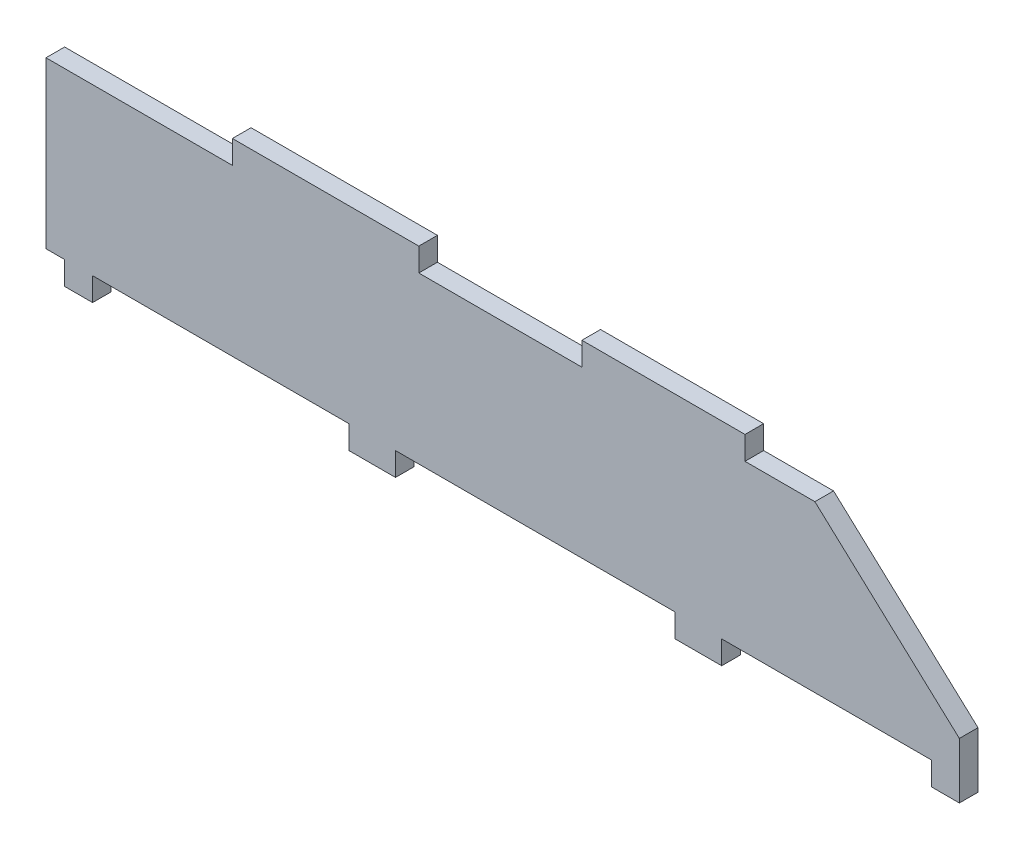
ISO-10303-21;
HEADER;
FILE_DESCRIPTION(('STEP AP214'),'2;1');
FILE_NAME('part.step','',(''),(''),'','','');
FILE_SCHEMA(('AUTOMOTIVE_DESIGN { 1 0 10303 214 1 1 1 1 }'));
ENDSEC;
DATA;
#1=APPLICATION_CONTEXT('core data for automotive mechanical design processes');
#2=APPLICATION_PROTOCOL_DEFINITION('international standard','automotive_design',2000,#1);
#3=PRODUCT_CONTEXT('',#1,'mechanical');
#4=PRODUCT('Part','Part','',(#3));
#5=PRODUCT_RELATED_PRODUCT_CATEGORY('part','',(#4));
#6=PRODUCT_DEFINITION_FORMATION('','',#4);
#7=PRODUCT_DEFINITION_CONTEXT('part definition',#1,'design');
#8=PRODUCT_DEFINITION('design','',#6,#7);
#9=PRODUCT_DEFINITION_SHAPE('','',#8);
#10=(LENGTH_UNIT() NAMED_UNIT(*) SI_UNIT(.MILLI.,.METRE.));
#11=(NAMED_UNIT(*) PLANE_ANGLE_UNIT() SI_UNIT($,.RADIAN.));
#12=(NAMED_UNIT(*) SI_UNIT($,.STERADIAN.) SOLID_ANGLE_UNIT());
#13=UNCERTAINTY_MEASURE_WITH_UNIT(LENGTH_MEASURE(1.E-05),#10,'distance_accuracy_value','');
#14=(GEOMETRIC_REPRESENTATION_CONTEXT(3) GLOBAL_UNCERTAINTY_ASSIGNED_CONTEXT((#13)) GLOBAL_UNIT_ASSIGNED_CONTEXT((#10,
#11,#12)) REPRESENTATION_CONTEXT('',''));
#15=CARTESIAN_POINT('',(0.,0.,0.));
#16=DIRECTION('',(0.,0.,1.));
#17=DIRECTION('',(1.,0.,0.));
#18=AXIS2_PLACEMENT_3D('',#15,#16,#17);
#19=CARTESIAN_POINT('',(35.,0.,4.));
#20=DIRECTION('',(1.,0.,0.));
#21=DIRECTION('',(0.,0.,-1.));
#22=AXIS2_PLACEMENT_3D('',#19,#20,#21);
#23=PLANE('',#22);
#24=DIRECTION('',(0.,-1.,0.));
#25=VECTOR('',#24,1.);
#26=CARTESIAN_POINT('',(35.,0.,0.));
#27=LINE('',#26,#25);
#28=CARTESIAN_POINT('',(35.,0.,0.));
#29=VERTEX_POINT('',#28);
#30=CARTESIAN_POINT('',(35.,-5.,0.));
#31=VERTEX_POINT('',#30);
#32=EDGE_CURVE('E243',#29,#31,#27,.T.);
#33=ORIENTED_EDGE('',*,*,#32,.T.);
#34=DIRECTION('',(0.,0.,-1.));
#35=VECTOR('',#34,1.);
#36=CARTESIAN_POINT('',(35.,-5.,4.));
#37=LINE('',#36,#35);
#38=CARTESIAN_POINT('',(35.,-5.,4.));
#39=VERTEX_POINT('',#38);
#40=EDGE_CURVE('E40',#39,#31,#37,.T.);
#41=ORIENTED_EDGE('',*,*,#40,.F.);
#42=DIRECTION('',(0.,-1.,0.));
#43=VECTOR('',#42,1.);
#44=CARTESIAN_POINT('',(35.,0.,4.));
#45=LINE('',#44,#43);
#46=CARTESIAN_POINT('',(35.,0.,4.));
#47=VERTEX_POINT('',#46);
#48=EDGE_CURVE('E147',#47,#39,#45,.T.);
#49=ORIENTED_EDGE('',*,*,#48,.F.);
#50=DIRECTION('',(0.,0.,-1.));
#51=VECTOR('',#50,1.);
#52=CARTESIAN_POINT('',(35.,0.,4.));
#53=LINE('',#52,#51);
#54=EDGE_CURVE('E11',#47,#29,#53,.T.);
#55=ORIENTED_EDGE('',*,*,#54,.T.);
#56=EDGE_LOOP('',(#33,#41,#49,#55));
#57=FACE_BOUND('',#56,.T.);
#58=ADVANCED_FACE('F32',(#57),#23,.F.);
#59=CARTESIAN_POINT('',(35.,-5.,4.));
#60=DIRECTION('',(0.,1.,0.));
#61=DIRECTION('',(0.,0.,1.));
#62=AXIS2_PLACEMENT_3D('',#59,#60,#61);
#63=PLANE('',#62);
#64=DIRECTION('',(1.,0.,0.));
#65=VECTOR('',#64,1.);
#66=CARTESIAN_POINT('',(35.,-5.,0.));
#67=LINE('',#66,#65);
#68=CARTESIAN_POINT('',(45.,-5.,0.));
#69=VERTEX_POINT('',#68);
#70=EDGE_CURVE('E245',#31,#69,#67,.T.);
#71=ORIENTED_EDGE('',*,*,#70,.T.);
#72=DIRECTION('',(0.,0.,-1.));
#73=VECTOR('',#72,1.);
#74=CARTESIAN_POINT('',(45.,-5.,4.));
#75=LINE('',#74,#73);
#76=CARTESIAN_POINT('',(45.,-5.,4.));
#77=VERTEX_POINT('',#76);
#78=EDGE_CURVE('E360',#77,#69,#75,.T.);
#79=ORIENTED_EDGE('',*,*,#78,.F.);
#80=DIRECTION('',(1.,0.,0.));
#81=VECTOR('',#80,1.);
#82=CARTESIAN_POINT('',(35.,-5.,4.));
#83=LINE('',#82,#81);
#84=EDGE_CURVE('E368',#39,#77,#83,.T.);
#85=ORIENTED_EDGE('',*,*,#84,.F.);
#86=ORIENTED_EDGE('',*,*,#40,.T.);
#87=EDGE_LOOP('',(#71,#79,#85,#86));
#88=FACE_BOUND('',#87,.T.);
#89=ADVANCED_FACE('F366',(#88),#63,.F.);
#90=CARTESIAN_POINT('',(45.,-5.,4.));
#91=DIRECTION('',(-1.,0.,0.));
#92=DIRECTION('',(0.,0.,1.));
#93=AXIS2_PLACEMENT_3D('',#90,#91,#92);
#94=PLANE('',#93);
#95=DIRECTION('',(0.,1.,0.));
#96=VECTOR('',#95,1.);
#97=CARTESIAN_POINT('',(45.,-5.,0.));
#98=LINE('',#97,#96);
#99=CARTESIAN_POINT('',(45.,0.,0.));
#100=VERTEX_POINT('',#99);
#101=EDGE_CURVE('E247',#69,#100,#98,.T.);
#102=ORIENTED_EDGE('',*,*,#101,.T.);
#103=DIRECTION('',(0.,0.,-1.));
#104=VECTOR('',#103,1.);
#105=CARTESIAN_POINT('',(45.,0.,4.));
#106=LINE('',#105,#104);
#107=CARTESIAN_POINT('',(45.,0.,4.));
#108=VERTEX_POINT('',#107);
#109=EDGE_CURVE('E357',#108,#100,#106,.T.);
#110=ORIENTED_EDGE('',*,*,#109,.F.);
#111=DIRECTION('',(0.,1.,0.));
#112=VECTOR('',#111,1.);
#113=CARTESIAN_POINT('',(45.,-5.,4.));
#114=LINE('',#113,#112);
#115=EDGE_CURVE('E386',#77,#108,#114,.T.);
#116=ORIENTED_EDGE('',*,*,#115,.F.);
#117=ORIENTED_EDGE('',*,*,#78,.T.);
#118=EDGE_LOOP('',(#102,#110,#116,#117));
#119=FACE_BOUND('',#118,.T.);
#120=ADVANCED_FACE('F377',(#119),#94,.F.);
#121=CARTESIAN_POINT('',(45.,0.,4.));
#122=DIRECTION('',(0.,1.,0.));
#123=DIRECTION('',(0.,0.,1.));
#124=AXIS2_PLACEMENT_3D('',#121,#122,#123);
#125=PLANE('',#124);
#126=DIRECTION('',(1.,0.,0.));
#127=VECTOR('',#126,1.);
#128=CARTESIAN_POINT('',(45.,0.,0.));
#129=LINE('',#128,#127);
#130=CARTESIAN_POINT('',(90.,0.,0.));
#131=VERTEX_POINT('',#130);
#132=EDGE_CURVE('E249',#100,#131,#129,.T.);
#133=ORIENTED_EDGE('',*,*,#132,.T.);
#134=DIRECTION('',(0.,0.,-1.));
#135=VECTOR('',#134,1.);
#136=CARTESIAN_POINT('',(90.,0.,4.));
#137=LINE('',#136,#135);
#138=CARTESIAN_POINT('',(90.,0.,4.));
#139=VERTEX_POINT('',#138);
#140=EDGE_CURVE('E354',#139,#131,#137,.T.);
#141=ORIENTED_EDGE('',*,*,#140,.F.);
#142=DIRECTION('',(1.,0.,0.));
#143=VECTOR('',#142,1.);
#144=CARTESIAN_POINT('',(45.,0.,4.));
#145=LINE('',#144,#143);
#146=EDGE_CURVE('E383',#108,#139,#145,.T.);
#147=ORIENTED_EDGE('',*,*,#146,.F.);
#148=ORIENTED_EDGE('',*,*,#109,.T.);
#149=EDGE_LOOP('',(#133,#141,#147,#148));
#150=FACE_BOUND('',#149,.T.);
#151=ADVANCED_FACE('F381',(#150),#125,.F.);
#152=CARTESIAN_POINT('',(90.,0.,4.));
#153=DIRECTION('',(1.,0.,0.));
#154=DIRECTION('',(0.,0.,-1.));
#155=AXIS2_PLACEMENT_3D('',#152,#153,#154);
#156=PLANE('',#155);
#157=DIRECTION('',(0.,-1.,0.));
#158=VECTOR('',#157,1.);
#159=CARTESIAN_POINT('',(90.,0.,0.));
#160=LINE('',#159,#158);
#161=CARTESIAN_POINT('',(90.,-5.,0.));
#162=VERTEX_POINT('',#161);
#163=EDGE_CURVE('E251',#131,#162,#160,.T.);
#164=ORIENTED_EDGE('',*,*,#163,.T.);
#165=DIRECTION('',(0.,0.,-1.));
#166=VECTOR('',#165,1.);
#167=CARTESIAN_POINT('',(90.,-5.,4.));
#168=LINE('',#167,#166);
#169=CARTESIAN_POINT('',(90.,-5.,4.));
#170=VERTEX_POINT('',#169);
#171=EDGE_CURVE('E351',#170,#162,#168,.T.);
#172=ORIENTED_EDGE('',*,*,#171,.F.);
#173=DIRECTION('',(0.,-1.,0.));
#174=VECTOR('',#173,1.);
#175=CARTESIAN_POINT('',(90.,0.,4.));
#176=LINE('',#175,#174);
#177=EDGE_CURVE('E385',#139,#170,#176,.T.);
#178=ORIENTED_EDGE('',*,*,#177,.F.);
#179=ORIENTED_EDGE('',*,*,#140,.T.);
#180=EDGE_LOOP('',(#164,#172,#178,#179));
#181=FACE_BOUND('',#180,.T.);
#182=ADVANCED_FACE('F461',(#181),#156,.F.);
#183=CARTESIAN_POINT('',(90.,-5.,4.));
#184=DIRECTION('',(0.,1.,0.));
#185=DIRECTION('',(0.,0.,1.));
#186=AXIS2_PLACEMENT_3D('',#183,#184,#185);
#187=PLANE('',#186);
#188=DIRECTION('',(1.,0.,0.));
#189=VECTOR('',#188,1.);
#190=CARTESIAN_POINT('',(90.,-5.,0.));
#191=LINE('',#190,#189);
#192=CARTESIAN_POINT('',(96.,-5.,0.));
#193=VERTEX_POINT('',#192);
#194=EDGE_CURVE('E253',#162,#193,#191,.T.);
#195=ORIENTED_EDGE('',*,*,#194,.T.);
#196=DIRECTION('',(0.,0.,-1.));
#197=VECTOR('',#196,1.);
#198=CARTESIAN_POINT('',(96.,-5.,4.));
#199=LINE('',#198,#197);
#200=CARTESIAN_POINT('',(96.,-5.,4.));
#201=VERTEX_POINT('',#200);
#202=EDGE_CURVE('E348',#201,#193,#199,.T.);
#203=ORIENTED_EDGE('',*,*,#202,.F.);
#204=DIRECTION('',(1.,0.,0.));
#205=VECTOR('',#204,1.);
#206=CARTESIAN_POINT('',(90.,-5.,4.));
#207=LINE('',#206,#205);
#208=EDGE_CURVE('E388',#170,#201,#207,.T.);
#209=ORIENTED_EDGE('',*,*,#208,.F.);
#210=ORIENTED_EDGE('',*,*,#171,.T.);
#211=EDGE_LOOP('',(#195,#203,#209,#210));
#212=FACE_BOUND('',#211,.T.);
#213=ADVANCED_FACE('F464',(#212),#187,.F.);
#214=CARTESIAN_POINT('',(96.,0.,4.));
#215=DIRECTION('',(-1.,0.,0.));
#216=DIRECTION('',(0.,0.,1.));
#217=AXIS2_PLACEMENT_3D('',#214,#215,#216);
#218=PLANE('',#217);
#219=DIRECTION('',(0.,1.,0.));
#220=VECTOR('',#219,1.);
#221=CARTESIAN_POINT('',(96.,0.,0.));
#222=LINE('',#221,#220);
#223=CARTESIAN_POINT('',(96.,7.,0.));
#224=VERTEX_POINT('',#223);
#225=EDGE_CURVE('E256',#193,#224,#222,.T.);
#226=ORIENTED_EDGE('',*,*,#225,.T.);
#227=DIRECTION('',(0.,0.,-1.));
#228=VECTOR('',#227,1.);
#229=CARTESIAN_POINT('',(96.,7.,4.));
#230=LINE('',#229,#228);
#231=CARTESIAN_POINT('',(96.,7.,4.));
#232=VERTEX_POINT('',#231);
#233=EDGE_CURVE('E345',#232,#224,#230,.T.);
#234=ORIENTED_EDGE('',*,*,#233,.F.);
#235=DIRECTION('',(0.,1.,0.));
#236=VECTOR('',#235,1.);
#237=CARTESIAN_POINT('',(96.,-5.,4.));
#238=LINE('',#237,#236);
#239=EDGE_CURVE('E394',#201,#232,#238,.T.);
#240=ORIENTED_EDGE('',*,*,#239,.F.);
#241=ORIENTED_EDGE('',*,*,#202,.T.);
#242=EDGE_LOOP('',(#226,#234,#240,#241));
#243=FACE_BOUND('',#242,.T.);
#244=ADVANCED_FACE('F468',(#243),#218,.F.);
#245=CARTESIAN_POINT('',(96.,7.,4.));
#246=DIRECTION('',(-0.676799260883116,-0.736167617100934,0.));
#247=DIRECTION('',(0.736167617100934,-0.676799260883116,0.));
#248=AXIS2_PLACEMENT_3D('',#245,#246,#247);
#249=PLANE('',#248);
#250=DIRECTION('',(-0.736167617100934,0.676799260883116,0.));
#251=VECTOR('',#250,1.);
#252=CARTESIAN_POINT('',(96.,7.,0.));
#253=LINE('',#252,#251);
#254=CARTESIAN_POINT('',(65.,35.5,0.));
#255=VERTEX_POINT('',#254);
#256=EDGE_CURVE('E258',#224,#255,#253,.T.);
#257=ORIENTED_EDGE('',*,*,#256,.T.);
#258=DIRECTION('',(0.,0.,-1.));
#259=VECTOR('',#258,1.);
#260=CARTESIAN_POINT('',(65.,35.5,4.));
#261=LINE('',#260,#259);
#262=CARTESIAN_POINT('',(65.,35.5,4.));
#263=VERTEX_POINT('',#262);
#264=EDGE_CURVE('E343',#263,#255,#261,.T.);
#265=ORIENTED_EDGE('',*,*,#264,.F.);
#266=DIRECTION('',(-0.736167617100934,0.676799260883116,0.));
#267=VECTOR('',#266,1.);
#268=CARTESIAN_POINT('',(96.,7.,4.));
#269=LINE('',#268,#267);
#270=EDGE_CURVE('E396',#232,#263,#269,.T.);
#271=ORIENTED_EDGE('',*,*,#270,.F.);
#272=ORIENTED_EDGE('',*,*,#233,.T.);
#273=EDGE_LOOP('',(#257,#265,#271,#272));
#274=FACE_BOUND('',#273,.T.);
#275=ADVANCED_FACE('F472',(#274),#249,.F.);
#276=CARTESIAN_POINT('',(50.,35.5,4.));
#277=DIRECTION('',(0.,1.,0.));
#278=DIRECTION('',(0.,0.,1.));
#279=AXIS2_PLACEMENT_3D('',#276,#277,#278);
#280=PLANE('',#279);
#281=DIRECTION('',(1.,0.,0.));
#282=VECTOR('',#281,1.);
#283=CARTESIAN_POINT('',(50.,35.5,0.));
#284=LINE('',#283,#282);
#285=CARTESIAN_POINT('',(50.,35.5,0.));
#286=VERTEX_POINT('',#285);
#287=EDGE_CURVE('E261',#286,#255,#284,.T.);
#288=ORIENTED_EDGE('',*,*,#287,.F.);
#289=DIRECTION('',(0.,0.,-1.));
#290=VECTOR('',#289,1.);
#291=CARTESIAN_POINT('',(50.,35.5,4.));
#292=LINE('',#291,#290);
#293=CARTESIAN_POINT('',(50.,35.5,4.));
#294=VERTEX_POINT('',#293);
#295=EDGE_CURVE('E341',#294,#286,#292,.T.);
#296=ORIENTED_EDGE('',*,*,#295,.F.);
#297=DIRECTION('',(1.,0.,0.));
#298=VECTOR('',#297,1.);
#299=CARTESIAN_POINT('',(50.,35.5,4.));
#300=LINE('',#299,#298);
#301=EDGE_CURVE('E398',#294,#263,#300,.T.);
#302=ORIENTED_EDGE('',*,*,#301,.T.);
#303=ORIENTED_EDGE('',*,*,#264,.T.);
#304=EDGE_LOOP('',(#288,#296,#302,#303));
#305=FACE_BOUND('',#304,.T.);
#306=ADVANCED_FACE('F476',(#305),#280,.T.);
#307=CARTESIAN_POINT('',(50.,40.5,4.));
#308=DIRECTION('',(1.,0.,0.));
#309=DIRECTION('',(0.,0.,-1.));
#310=AXIS2_PLACEMENT_3D('',#307,#308,#309);
#311=PLANE('',#310);
#312=DIRECTION('',(0.,-1.,0.));
#313=VECTOR('',#312,1.);
#314=CARTESIAN_POINT('',(50.,40.5,0.));
#315=LINE('',#314,#313);
#316=CARTESIAN_POINT('',(50.,40.5,0.));
#317=VERTEX_POINT('',#316);
#318=EDGE_CURVE('E264',#317,#286,#315,.T.);
#319=ORIENTED_EDGE('',*,*,#318,.F.);
#320=DIRECTION('',(0.,0.,-1.));
#321=VECTOR('',#320,1.);
#322=CARTESIAN_POINT('',(50.,40.5,4.));
#323=LINE('',#322,#321);
#324=CARTESIAN_POINT('',(50.,40.5,4.));
#325=VERTEX_POINT('',#324);
#326=EDGE_CURVE('E339',#325,#317,#323,.T.);
#327=ORIENTED_EDGE('',*,*,#326,.F.);
#328=DIRECTION('',(0.,-1.,0.));
#329=VECTOR('',#328,1.);
#330=CARTESIAN_POINT('',(50.,40.5,4.));
#331=LINE('',#330,#329);
#332=EDGE_CURVE('E401',#325,#294,#331,.T.);
#333=ORIENTED_EDGE('',*,*,#332,.T.);
#334=ORIENTED_EDGE('',*,*,#295,.T.);
#335=EDGE_LOOP('',(#319,#327,#333,#334));
#336=FACE_BOUND('',#335,.T.);
#337=ADVANCED_FACE('F480',(#336),#311,.T.);
#338=CARTESIAN_POINT('',(15.,40.5,4.));
#339=DIRECTION('',(0.,1.,0.));
#340=DIRECTION('',(0.,0.,1.));
#341=AXIS2_PLACEMENT_3D('',#338,#339,#340);
#342=PLANE('',#341);
#343=DIRECTION('',(1.,0.,0.));
#344=VECTOR('',#343,1.);
#345=CARTESIAN_POINT('',(15.,40.5,0.));
#346=LINE('',#345,#344);
#347=CARTESIAN_POINT('',(15.,40.5,0.));
#348=VERTEX_POINT('',#347);
#349=EDGE_CURVE('E267',#348,#317,#346,.T.);
#350=ORIENTED_EDGE('',*,*,#349,.F.);
#351=DIRECTION('',(0.,0.,-1.));
#352=VECTOR('',#351,1.);
#353=CARTESIAN_POINT('',(15.,40.5,4.));
#354=LINE('',#353,#352);
#355=CARTESIAN_POINT('',(15.,40.5,4.));
#356=VERTEX_POINT('',#355);
#357=EDGE_CURVE('E337',#356,#348,#354,.T.);
#358=ORIENTED_EDGE('',*,*,#357,.F.);
#359=DIRECTION('',(1.,0.,0.));
#360=VECTOR('',#359,1.);
#361=CARTESIAN_POINT('',(15.,40.5,4.));
#362=LINE('',#361,#360);
#363=EDGE_CURVE('E404',#356,#325,#362,.T.);
#364=ORIENTED_EDGE('',*,*,#363,.T.);
#365=ORIENTED_EDGE('',*,*,#326,.T.);
#366=EDGE_LOOP('',(#350,#358,#364,#365));
#367=FACE_BOUND('',#366,.T.);
#368=ADVANCED_FACE('F484',(#367),#342,.T.);
#369=CARTESIAN_POINT('',(15.,35.5,4.));
#370=DIRECTION('',(-1.,0.,0.));
#371=DIRECTION('',(0.,0.,1.));
#372=AXIS2_PLACEMENT_3D('',#369,#370,#371);
#373=PLANE('',#372);
#374=DIRECTION('',(0.,1.,0.));
#375=VECTOR('',#374,1.);
#376=CARTESIAN_POINT('',(15.,35.5,0.));
#377=LINE('',#376,#375);
#378=CARTESIAN_POINT('',(15.,35.5,0.));
#379=VERTEX_POINT('',#378);
#380=EDGE_CURVE('E270',#379,#348,#377,.T.);
#381=ORIENTED_EDGE('',*,*,#380,.F.);
#382=DIRECTION('',(0.,0.,-1.));
#383=VECTOR('',#382,1.);
#384=CARTESIAN_POINT('',(15.,35.5,4.));
#385=LINE('',#384,#383);
#386=CARTESIAN_POINT('',(15.,35.5,4.));
#387=VERTEX_POINT('',#386);
#388=EDGE_CURVE('E335',#387,#379,#385,.T.);
#389=ORIENTED_EDGE('',*,*,#388,.F.);
#390=DIRECTION('',(0.,1.,0.));
#391=VECTOR('',#390,1.);
#392=CARTESIAN_POINT('',(15.,35.5,4.));
#393=LINE('',#392,#391);
#394=EDGE_CURVE('E407',#387,#356,#393,.T.);
#395=ORIENTED_EDGE('',*,*,#394,.T.);
#396=ORIENTED_EDGE('',*,*,#357,.T.);
#397=EDGE_LOOP('',(#381,#389,#395,#396));
#398=FACE_BOUND('',#397,.T.);
#399=ADVANCED_FACE('F488',(#398),#373,.T.);
#400=CARTESIAN_POINT('',(-20.,35.5,4.));
#401=DIRECTION('',(0.,1.,0.));
#402=DIRECTION('',(0.,0.,1.));
#403=AXIS2_PLACEMENT_3D('',#400,#401,#402);
#404=PLANE('',#403);
#405=DIRECTION('',(1.,0.,0.));
#406=VECTOR('',#405,1.);
#407=CARTESIAN_POINT('',(-20.,35.5,0.));
#408=LINE('',#407,#406);
#409=CARTESIAN_POINT('',(-20.,35.5,0.));
#410=VERTEX_POINT('',#409);
#411=EDGE_CURVE('E273',#410,#379,#408,.T.);
#412=ORIENTED_EDGE('',*,*,#411,.F.);
#413=DIRECTION('',(0.,0.,-1.));
#414=VECTOR('',#413,1.);
#415=CARTESIAN_POINT('',(-20.,35.5,4.));
#416=LINE('',#415,#414);
#417=CARTESIAN_POINT('',(-20.,35.5,4.));
#418=VERTEX_POINT('',#417);
#419=EDGE_CURVE('E333',#418,#410,#416,.T.);
#420=ORIENTED_EDGE('',*,*,#419,.F.);
#421=DIRECTION('',(1.,0.,0.));
#422=VECTOR('',#421,1.);
#423=CARTESIAN_POINT('',(-20.,35.5,4.));
#424=LINE('',#423,#422);
#425=EDGE_CURVE('E410',#418,#387,#424,.T.);
#426=ORIENTED_EDGE('',*,*,#425,.T.);
#427=ORIENTED_EDGE('',*,*,#388,.T.);
#428=EDGE_LOOP('',(#412,#420,#426,#427));
#429=FACE_BOUND('',#428,.T.);
#430=ADVANCED_FACE('F492',(#429),#404,.T.);
#431=CARTESIAN_POINT('',(-20.,40.5,4.));
#432=DIRECTION('',(1.,0.,0.));
#433=DIRECTION('',(0.,0.,-1.));
#434=AXIS2_PLACEMENT_3D('',#431,#432,#433);
#435=PLANE('',#434);
#436=DIRECTION('',(0.,-1.,0.));
#437=VECTOR('',#436,1.);
#438=CARTESIAN_POINT('',(-20.,40.5,0.));
#439=LINE('',#438,#437);
#440=CARTESIAN_POINT('',(-20.,40.5,0.));
#441=VERTEX_POINT('',#440);
#442=EDGE_CURVE('E276',#441,#410,#439,.T.);
#443=ORIENTED_EDGE('',*,*,#442,.F.);
#444=DIRECTION('',(0.,0.,-1.));
#445=VECTOR('',#444,1.);
#446=CARTESIAN_POINT('',(-20.,40.5,4.));
#447=LINE('',#446,#445);
#448=CARTESIAN_POINT('',(-20.,40.5,4.));
#449=VERTEX_POINT('',#448);
#450=EDGE_CURVE('E331',#449,#441,#447,.T.);
#451=ORIENTED_EDGE('',*,*,#450,.F.);
#452=DIRECTION('',(0.,-1.,0.));
#453=VECTOR('',#452,1.);
#454=CARTESIAN_POINT('',(-20.,40.5,4.));
#455=LINE('',#454,#453);
#456=EDGE_CURVE('E413',#449,#418,#455,.T.);
#457=ORIENTED_EDGE('',*,*,#456,.T.);
#458=ORIENTED_EDGE('',*,*,#419,.T.);
#459=EDGE_LOOP('',(#443,#451,#457,#458));
#460=FACE_BOUND('',#459,.T.);
#461=ADVANCED_FACE('F496',(#460),#435,.T.);
#462=CARTESIAN_POINT('',(-60.,40.5,4.));
#463=DIRECTION('',(0.,1.,0.));
#464=DIRECTION('',(0.,0.,1.));
#465=AXIS2_PLACEMENT_3D('',#462,#463,#464);
#466=PLANE('',#465);
#467=DIRECTION('',(1.,0.,0.));
#468=VECTOR('',#467,1.);
#469=CARTESIAN_POINT('',(-60.,40.5,0.));
#470=LINE('',#469,#468);
#471=CARTESIAN_POINT('',(-60.,40.5,0.));
#472=VERTEX_POINT('',#471);
#473=EDGE_CURVE('E279',#472,#441,#470,.T.);
#474=ORIENTED_EDGE('',*,*,#473,.F.);
#475=DIRECTION('',(0.,0.,-1.));
#476=VECTOR('',#475,1.);
#477=CARTESIAN_POINT('',(-60.,40.5,4.));
#478=LINE('',#477,#476);
#479=CARTESIAN_POINT('',(-60.,40.5,4.));
#480=VERTEX_POINT('',#479);
#481=EDGE_CURVE('E329',#480,#472,#478,.T.);
#482=ORIENTED_EDGE('',*,*,#481,.F.);
#483=DIRECTION('',(1.,0.,0.));
#484=VECTOR('',#483,1.);
#485=CARTESIAN_POINT('',(-60.,40.5,4.));
#486=LINE('',#485,#484);
#487=EDGE_CURVE('E416',#480,#449,#486,.T.);
#488=ORIENTED_EDGE('',*,*,#487,.T.);
#489=ORIENTED_EDGE('',*,*,#450,.T.);
#490=EDGE_LOOP('',(#474,#482,#488,#489));
#491=FACE_BOUND('',#490,.T.);
#492=ADVANCED_FACE('F500',(#491),#466,.T.);
#493=CARTESIAN_POINT('',(-60.,35.5,4.));
#494=DIRECTION('',(-1.,0.,0.));
#495=DIRECTION('',(0.,0.,1.));
#496=AXIS2_PLACEMENT_3D('',#493,#494,#495);
#497=PLANE('',#496);
#498=DIRECTION('',(0.,1.,0.));
#499=VECTOR('',#498,1.);
#500=CARTESIAN_POINT('',(-60.,35.5,0.));
#501=LINE('',#500,#499);
#502=CARTESIAN_POINT('',(-60.,35.5,0.));
#503=VERTEX_POINT('',#502);
#504=EDGE_CURVE('E282',#503,#472,#501,.T.);
#505=ORIENTED_EDGE('',*,*,#504,.F.);
#506=DIRECTION('',(0.,0.,-1.));
#507=VECTOR('',#506,1.);
#508=CARTESIAN_POINT('',(-60.,35.5,4.));
#509=LINE('',#508,#507);
#510=CARTESIAN_POINT('',(-60.,35.5,4.));
#511=VERTEX_POINT('',#510);
#512=EDGE_CURVE('E327',#511,#503,#509,.T.);
#513=ORIENTED_EDGE('',*,*,#512,.F.);
#514=DIRECTION('',(0.,1.,0.));
#515=VECTOR('',#514,1.);
#516=CARTESIAN_POINT('',(-60.,35.5,4.));
#517=LINE('',#516,#515);
#518=EDGE_CURVE('E419',#511,#480,#517,.T.);
#519=ORIENTED_EDGE('',*,*,#518,.T.);
#520=ORIENTED_EDGE('',*,*,#481,.T.);
#521=EDGE_LOOP('',(#505,#513,#519,#520));
#522=FACE_BOUND('',#521,.T.);
#523=ADVANCED_FACE('F504',(#522),#497,.T.);
#524=CARTESIAN_POINT('',(-100.,35.5,4.));
#525=DIRECTION('',(0.,1.,0.));
#526=DIRECTION('',(0.,0.,1.));
#527=AXIS2_PLACEMENT_3D('',#524,#525,#526);
#528=PLANE('',#527);
#529=DIRECTION('',(1.,0.,0.));
#530=VECTOR('',#529,1.);
#531=CARTESIAN_POINT('',(-100.,35.5,0.));
#532=LINE('',#531,#530);
#533=CARTESIAN_POINT('',(-100.,35.5,0.));
#534=VERTEX_POINT('',#533);
#535=EDGE_CURVE('E285',#534,#503,#532,.T.);
#536=ORIENTED_EDGE('',*,*,#535,.F.);
#537=DIRECTION('',(0.,0.,-1.));
#538=VECTOR('',#537,1.);
#539=CARTESIAN_POINT('',(-100.,35.5,4.));
#540=LINE('',#539,#538);
#541=CARTESIAN_POINT('',(-100.,35.5,4.));
#542=VERTEX_POINT('',#541);
#543=EDGE_CURVE('E325',#542,#534,#540,.T.);
#544=ORIENTED_EDGE('',*,*,#543,.F.);
#545=DIRECTION('',(1.,0.,0.));
#546=VECTOR('',#545,1.);
#547=CARTESIAN_POINT('',(-100.,35.5,4.));
#548=LINE('',#547,#546);
#549=EDGE_CURVE('E422',#542,#511,#548,.T.);
#550=ORIENTED_EDGE('',*,*,#549,.T.);
#551=ORIENTED_EDGE('',*,*,#512,.T.);
#552=EDGE_LOOP('',(#536,#544,#550,#551));
#553=FACE_BOUND('',#552,.T.);
#554=ADVANCED_FACE('F508',(#553),#528,.T.);
#555=CARTESIAN_POINT('',(-100.,0.,4.));
#556=DIRECTION('',(-1.,0.,0.));
#557=DIRECTION('',(0.,0.,1.));
#558=AXIS2_PLACEMENT_3D('',#555,#556,#557);
#559=PLANE('',#558);
#560=DIRECTION('',(0.,1.,0.));
#561=VECTOR('',#560,1.);
#562=CARTESIAN_POINT('',(-100.,0.,0.));
#563=LINE('',#562,#561);
#564=CARTESIAN_POINT('',(-100.,0.,0.));
#565=VERTEX_POINT('',#564);
#566=EDGE_CURVE('E288',#565,#534,#563,.T.);
#567=ORIENTED_EDGE('',*,*,#566,.F.);
#568=DIRECTION('',(0.,0.,-1.));
#569=VECTOR('',#568,1.);
#570=CARTESIAN_POINT('',(-100.,0.,4.));
#571=LINE('',#570,#569);
#572=CARTESIAN_POINT('',(-100.,0.,4.));
#573=VERTEX_POINT('',#572);
#574=EDGE_CURVE('E323',#573,#565,#571,.T.);
#575=ORIENTED_EDGE('',*,*,#574,.F.);
#576=DIRECTION('',(0.,1.,0.));
#577=VECTOR('',#576,1.);
#578=CARTESIAN_POINT('',(-100.,0.,4.));
#579=LINE('',#578,#577);
#580=EDGE_CURVE('E425',#573,#542,#579,.T.);
#581=ORIENTED_EDGE('',*,*,#580,.T.);
#582=ORIENTED_EDGE('',*,*,#543,.T.);
#583=EDGE_LOOP('',(#567,#575,#581,#582));
#584=FACE_BOUND('',#583,.T.);
#585=ADVANCED_FACE('F512',(#584),#559,.T.);
#586=CARTESIAN_POINT('',(-100.,0.,4.));
#587=DIRECTION('',(0.,1.,0.));
#588=DIRECTION('',(0.,0.,1.));
#589=AXIS2_PLACEMENT_3D('',#586,#587,#588);
#590=PLANE('',#589);
#591=DIRECTION('',(1.,0.,0.));
#592=VECTOR('',#591,1.);
#593=CARTESIAN_POINT('',(-100.,0.,0.));
#594=LINE('',#593,#592);
#595=CARTESIAN_POINT('',(-96.,0.,0.));
#596=VERTEX_POINT('',#595);
#597=EDGE_CURVE('E291',#565,#596,#594,.T.);
#598=ORIENTED_EDGE('',*,*,#597,.T.);
#599=DIRECTION('',(0.,0.,-1.));
#600=VECTOR('',#599,1.);
#601=CARTESIAN_POINT('',(-96.,0.,4.));
#602=LINE('',#601,#600);
#603=CARTESIAN_POINT('',(-96.,0.,4.));
#604=VERTEX_POINT('',#603);
#605=EDGE_CURVE('E320',#604,#596,#602,.T.);
#606=ORIENTED_EDGE('',*,*,#605,.F.);
#607=DIRECTION('',(1.,0.,0.));
#608=VECTOR('',#607,1.);
#609=CARTESIAN_POINT('',(-100.,0.,4.));
#610=LINE('',#609,#608);
#611=EDGE_CURVE('E428',#573,#604,#610,.T.);
#612=ORIENTED_EDGE('',*,*,#611,.F.);
#613=ORIENTED_EDGE('',*,*,#574,.T.);
#614=EDGE_LOOP('',(#598,#606,#612,#613));
#615=FACE_BOUND('',#614,.T.);
#616=ADVANCED_FACE('F516',(#615),#590,.F.);
#617=CARTESIAN_POINT('',(-96.,0.,4.));
#618=DIRECTION('',(1.,0.,0.));
#619=DIRECTION('',(0.,0.,-1.));
#620=AXIS2_PLACEMENT_3D('',#617,#618,#619);
#621=PLANE('',#620);
#622=DIRECTION('',(0.,-1.,0.));
#623=VECTOR('',#622,1.);
#624=CARTESIAN_POINT('',(-96.,0.,0.));
#625=LINE('',#624,#623);
#626=CARTESIAN_POINT('',(-96.,-5.,0.));
#627=VERTEX_POINT('',#626);
#628=EDGE_CURVE('E293',#596,#627,#625,.T.);
#629=ORIENTED_EDGE('',*,*,#628,.T.);
#630=DIRECTION('',(0.,0.,-1.));
#631=VECTOR('',#630,1.);
#632=CARTESIAN_POINT('',(-96.,-5.,4.));
#633=LINE('',#632,#631);
#634=CARTESIAN_POINT('',(-96.,-5.,4.));
#635=VERTEX_POINT('',#634);
#636=EDGE_CURVE('E317',#635,#627,#633,.T.);
#637=ORIENTED_EDGE('',*,*,#636,.F.);
#638=DIRECTION('',(0.,-1.,0.));
#639=VECTOR('',#638,1.);
#640=CARTESIAN_POINT('',(-96.,0.,4.));
#641=LINE('',#640,#639);
#642=EDGE_CURVE('E430',#604,#635,#641,.T.);
#643=ORIENTED_EDGE('',*,*,#642,.F.);
#644=ORIENTED_EDGE('',*,*,#605,.T.);
#645=EDGE_LOOP('',(#629,#637,#643,#644));
#646=FACE_BOUND('',#645,.T.);
#647=ADVANCED_FACE('F520',(#646),#621,.F.);
#648=CARTESIAN_POINT('',(-96.,-5.,4.));
#649=DIRECTION('',(0.,1.,0.));
#650=DIRECTION('',(0.,0.,1.));
#651=AXIS2_PLACEMENT_3D('',#648,#649,#650);
#652=PLANE('',#651);
#653=DIRECTION('',(1.,0.,0.));
#654=VECTOR('',#653,1.);
#655=CARTESIAN_POINT('',(-96.,-5.,0.));
#656=LINE('',#655,#654);
#657=CARTESIAN_POINT('',(-90.,-5.,0.));
#658=VERTEX_POINT('',#657);
#659=EDGE_CURVE('E295',#627,#658,#656,.T.);
#660=ORIENTED_EDGE('',*,*,#659,.T.);
#661=DIRECTION('',(0.,0.,-1.));
#662=VECTOR('',#661,1.);
#663=CARTESIAN_POINT('',(-90.,-5.,4.));
#664=LINE('',#663,#662);
#665=CARTESIAN_POINT('',(-90.,-5.,4.));
#666=VERTEX_POINT('',#665);
#667=EDGE_CURVE('E314',#666,#658,#664,.T.);
#668=ORIENTED_EDGE('',*,*,#667,.F.);
#669=DIRECTION('',(1.,0.,0.));
#670=VECTOR('',#669,1.);
#671=CARTESIAN_POINT('',(-96.,-5.,4.));
#672=LINE('',#671,#670);
#673=EDGE_CURVE('E432',#635,#666,#672,.T.);
#674=ORIENTED_EDGE('',*,*,#673,.F.);
#675=ORIENTED_EDGE('',*,*,#636,.T.);
#676=EDGE_LOOP('',(#660,#668,#674,#675));
#677=FACE_BOUND('',#676,.T.);
#678=ADVANCED_FACE('F524',(#677),#652,.F.);
#679=CARTESIAN_POINT('',(-90.,-5.,4.));
#680=DIRECTION('',(-1.,0.,0.));
#681=DIRECTION('',(0.,0.,1.));
#682=AXIS2_PLACEMENT_3D('',#679,#680,#681);
#683=PLANE('',#682);
#684=DIRECTION('',(0.,1.,0.));
#685=VECTOR('',#684,1.);
#686=CARTESIAN_POINT('',(-90.,-5.,0.));
#687=LINE('',#686,#685);
#688=CARTESIAN_POINT('',(-90.,0.,0.));
#689=VERTEX_POINT('',#688);
#690=EDGE_CURVE('E297',#658,#689,#687,.T.);
#691=ORIENTED_EDGE('',*,*,#690,.T.);
#692=DIRECTION('',(0.,0.,-1.));
#693=VECTOR('',#692,1.);
#694=CARTESIAN_POINT('',(-90.,0.,4.));
#695=LINE('',#694,#693);
#696=CARTESIAN_POINT('',(-90.,0.,4.));
#697=VERTEX_POINT('',#696);
#698=EDGE_CURVE('E311',#697,#689,#695,.T.);
#699=ORIENTED_EDGE('',*,*,#698,.F.);
#700=DIRECTION('',(0.,1.,0.));
#701=VECTOR('',#700,1.);
#702=CARTESIAN_POINT('',(-90.,-5.,4.));
#703=LINE('',#702,#701);
#704=EDGE_CURVE('E434',#666,#697,#703,.T.);
#705=ORIENTED_EDGE('',*,*,#704,.F.);
#706=ORIENTED_EDGE('',*,*,#667,.T.);
#707=EDGE_LOOP('',(#691,#699,#705,#706));
#708=FACE_BOUND('',#707,.T.);
#709=ADVANCED_FACE('F440',(#708),#683,.F.);
#710=CARTESIAN_POINT('',(-90.,0.,4.));
#711=DIRECTION('',(0.,1.,0.));
#712=DIRECTION('',(0.,0.,1.));
#713=AXIS2_PLACEMENT_3D('',#710,#711,#712);
#714=PLANE('',#713);
#715=DIRECTION('',(1.,0.,0.));
#716=VECTOR('',#715,1.);
#717=CARTESIAN_POINT('',(-90.,0.,0.));
#718=LINE('',#717,#716);
#719=CARTESIAN_POINT('',(-35.,0.,0.));
#720=VERTEX_POINT('',#719);
#721=EDGE_CURVE('E299',#689,#720,#718,.T.);
#722=ORIENTED_EDGE('',*,*,#721,.T.);
#723=DIRECTION('',(0.,0.,-1.));
#724=VECTOR('',#723,1.);
#725=CARTESIAN_POINT('',(-35.,0.,4.));
#726=LINE('',#725,#724);
#727=CARTESIAN_POINT('',(-35.,0.,4.));
#728=VERTEX_POINT('',#727);
#729=EDGE_CURVE('E233',#728,#720,#726,.T.);
#730=ORIENTED_EDGE('',*,*,#729,.F.);
#731=DIRECTION('',(1.,0.,0.));
#732=VECTOR('',#731,1.);
#733=CARTESIAN_POINT('',(-90.,0.,4.));
#734=LINE('',#733,#732);
#735=EDGE_CURVE('E224',#697,#728,#734,.T.);
#736=ORIENTED_EDGE('',*,*,#735,.F.);
#737=ORIENTED_EDGE('',*,*,#698,.T.);
#738=EDGE_LOOP('',(#722,#730,#736,#737));
#739=FACE_BOUND('',#738,.T.);
#740=ADVANCED_FACE('F444',(#739),#714,.F.);
#741=CARTESIAN_POINT('',(-35.,0.,4.));
#742=DIRECTION('',(1.,0.,0.));
#743=DIRECTION('',(0.,0.,-1.));
#744=AXIS2_PLACEMENT_3D('',#741,#742,#743);
#745=PLANE('',#744);
#746=DIRECTION('',(0.,-1.,0.));
#747=VECTOR('',#746,1.);
#748=CARTESIAN_POINT('',(-35.,0.,0.));
#749=LINE('',#748,#747);
#750=CARTESIAN_POINT('',(-35.,-5.,0.));
#751=VERTEX_POINT('',#750);
#752=EDGE_CURVE('E232',#720,#751,#749,.T.);
#753=ORIENTED_EDGE('',*,*,#752,.T.);
#754=DIRECTION('',(0.,0.,-1.));
#755=VECTOR('',#754,1.);
#756=CARTESIAN_POINT('',(-35.,-5.,4.));
#757=LINE('',#756,#755);
#758=CARTESIAN_POINT('',(-35.,-5.,4.));
#759=VERTEX_POINT('',#758);
#760=EDGE_CURVE('E229',#759,#751,#757,.T.);
#761=ORIENTED_EDGE('',*,*,#760,.F.);
#762=DIRECTION('',(0.,-1.,0.));
#763=VECTOR('',#762,1.);
#764=CARTESIAN_POINT('',(-35.,0.,4.));
#765=LINE('',#764,#763);
#766=EDGE_CURVE('E218',#728,#759,#765,.T.);
#767=ORIENTED_EDGE('',*,*,#766,.F.);
#768=ORIENTED_EDGE('',*,*,#729,.T.);
#769=EDGE_LOOP('',(#753,#761,#767,#768));
#770=FACE_BOUND('',#769,.T.);
#771=ADVANCED_FACE('F230',(#770),#745,.F.);
#772=CARTESIAN_POINT('',(-35.,-5.,4.));
#773=DIRECTION('',(0.,1.,0.));
#774=DIRECTION('',(0.,0.,1.));
#775=AXIS2_PLACEMENT_3D('',#772,#773,#774);
#776=PLANE('',#775);
#777=DIRECTION('',(1.,0.,0.));
#778=VECTOR('',#777,1.);
#779=CARTESIAN_POINT('',(-35.,-5.,0.));
#780=LINE('',#779,#778);
#781=CARTESIAN_POINT('',(-25.,-5.,0.));
#782=VERTEX_POINT('',#781);
#783=EDGE_CURVE('E135',#751,#782,#780,.T.);
#784=ORIENTED_EDGE('',*,*,#783,.T.);
#785=DIRECTION('',(0.,0.,-1.));
#786=VECTOR('',#785,1.);
#787=CARTESIAN_POINT('',(-25.,-5.,4.));
#788=LINE('',#787,#786);
#789=CARTESIAN_POINT('',(-25.,-5.,4.));
#790=VERTEX_POINT('',#789);
#791=EDGE_CURVE('E234',#790,#782,#788,.T.);
#792=ORIENTED_EDGE('',*,*,#791,.F.);
#793=DIRECTION('',(1.,0.,0.));
#794=VECTOR('',#793,1.);
#795=CARTESIAN_POINT('',(-35.,-5.,4.));
#796=LINE('',#795,#794);
#797=EDGE_CURVE('E222',#759,#790,#796,.T.);
#798=ORIENTED_EDGE('',*,*,#797,.F.);
#799=ORIENTED_EDGE('',*,*,#760,.T.);
#800=EDGE_LOOP('',(#784,#792,#798,#799));
#801=FACE_BOUND('',#800,.T.);
#802=ADVANCED_FACE('F236',(#801),#776,.F.);
#803=CARTESIAN_POINT('',(-25.,-5.,4.));
#804=DIRECTION('',(-1.,0.,0.));
#805=DIRECTION('',(0.,0.,1.));
#806=AXIS2_PLACEMENT_3D('',#803,#804,#805);
#807=PLANE('',#806);
#808=DIRECTION('',(0.,1.,0.));
#809=VECTOR('',#808,1.);
#810=CARTESIAN_POINT('',(-25.,-5.,0.));
#811=LINE('',#810,#809);
#812=CARTESIAN_POINT('',(-25.,0.,0.));
#813=VERTEX_POINT('',#812);
#814=EDGE_CURVE('E303',#782,#813,#811,.T.);
#815=ORIENTED_EDGE('',*,*,#814,.T.);
#816=DIRECTION('',(0.,0.,-1.));
#817=VECTOR('',#816,1.);
#818=CARTESIAN_POINT('',(-25.,0.,4.));
#819=LINE('',#818,#817);
#820=CARTESIAN_POINT('',(-25.,0.,4.));
#821=VERTEX_POINT('',#820);
#822=EDGE_CURVE('E139',#821,#813,#819,.T.);
#823=ORIENTED_EDGE('',*,*,#822,.F.);
#824=DIRECTION('',(0.,1.,0.));
#825=VECTOR('',#824,1.);
#826=CARTESIAN_POINT('',(-25.,-5.,4.));
#827=LINE('',#826,#825);
#828=EDGE_CURVE('E238',#790,#821,#827,.T.);
#829=ORIENTED_EDGE('',*,*,#828,.F.);
#830=ORIENTED_EDGE('',*,*,#791,.T.);
#831=EDGE_LOOP('',(#815,#823,#829,#830));
#832=FACE_BOUND('',#831,.T.);
#833=ADVANCED_FACE('F447',(#832),#807,.F.);
#834=CARTESIAN_POINT('',(0.,0.,4.));
#835=DIRECTION('',(0.,-1.,0.));
#836=DIRECTION('',(0.,0.,-1.));
#837=AXIS2_PLACEMENT_3D('',#834,#835,#836);
#838=PLANE('',#837);
#839=DIRECTION('',(-1.,0.,0.));
#840=VECTOR('',#839,1.);
#841=CARTESIAN_POINT('',(0.,0.,0.));
#842=LINE('',#841,#840);
#843=EDGE_CURVE('E305',#29,#813,#842,.T.);
#844=ORIENTED_EDGE('',*,*,#843,.F.);
#845=ORIENTED_EDGE('',*,*,#54,.F.);
#846=DIRECTION('',(1.,0.,0.));
#847=VECTOR('',#846,1.);
#848=CARTESIAN_POINT('',(0.,0.,4.));
#849=LINE('',#848,#847);
#850=EDGE_CURVE('E48',#821,#47,#849,.T.);
#851=ORIENTED_EDGE('',*,*,#850,.F.);
#852=ORIENTED_EDGE('',*,*,#822,.T.);
#853=EDGE_LOOP('',(#844,#845,#851,#852));
#854=FACE_BOUND('',#853,.T.);
#855=ADVANCED_FACE('F449',(#854),#838,.T.);
#856=CARTESIAN_POINT('',(0.,0.,4.));
#857=DIRECTION('',(0.,0.,-1.));
#858=DIRECTION('',(-1.,0.,0.));
#859=AXIS2_PLACEMENT_3D('',#856,#857,#858);
#860=PLANE('',#859);
#861=ORIENTED_EDGE('',*,*,#850,.T.);
#862=ORIENTED_EDGE('',*,*,#48,.T.);
#863=ORIENTED_EDGE('',*,*,#84,.T.);
#864=ORIENTED_EDGE('',*,*,#115,.T.);
#865=ORIENTED_EDGE('',*,*,#146,.T.);
#866=ORIENTED_EDGE('',*,*,#177,.T.);
#867=ORIENTED_EDGE('',*,*,#208,.T.);
#868=ORIENTED_EDGE('',*,*,#239,.T.);
#869=ORIENTED_EDGE('',*,*,#270,.T.);
#870=ORIENTED_EDGE('',*,*,#301,.F.);
#871=ORIENTED_EDGE('',*,*,#332,.F.);
#872=ORIENTED_EDGE('',*,*,#363,.F.);
#873=ORIENTED_EDGE('',*,*,#394,.F.);
#874=ORIENTED_EDGE('',*,*,#425,.F.);
#875=ORIENTED_EDGE('',*,*,#456,.F.);
#876=ORIENTED_EDGE('',*,*,#487,.F.);
#877=ORIENTED_EDGE('',*,*,#518,.F.);
#878=ORIENTED_EDGE('',*,*,#549,.F.);
#879=ORIENTED_EDGE('',*,*,#580,.F.);
#880=ORIENTED_EDGE('',*,*,#611,.T.);
#881=ORIENTED_EDGE('',*,*,#642,.T.);
#882=ORIENTED_EDGE('',*,*,#673,.T.);
#883=ORIENTED_EDGE('',*,*,#704,.T.);
#884=ORIENTED_EDGE('',*,*,#735,.T.);
#885=ORIENTED_EDGE('',*,*,#766,.T.);
#886=ORIENTED_EDGE('',*,*,#797,.T.);
#887=ORIENTED_EDGE('',*,*,#828,.T.);
#888=EDGE_LOOP('',(#861,#862,#863,#864,#865,#866,#867,#868,#869,#870,#871,#872,#873,#874,#875,
#876,#877,#878,#879,#880,#881,#882,#883,#884,#885,#886,#887));
#889=FACE_BOUND('',#888,.T.);
#890=ADVANCED_FACE('F220',(#889),#860,.F.);
#891=CARTESIAN_POINT('',(0.,0.,0.));
#892=DIRECTION('',(0.,0.,-1.));
#893=DIRECTION('',(-1.,0.,0.));
#894=AXIS2_PLACEMENT_3D('',#891,#892,#893);
#895=PLANE('',#894);
#896=ORIENTED_EDGE('',*,*,#32,.F.);
#897=ORIENTED_EDGE('',*,*,#843,.T.);
#898=ORIENTED_EDGE('',*,*,#814,.F.);
#899=ORIENTED_EDGE('',*,*,#783,.F.);
#900=ORIENTED_EDGE('',*,*,#752,.F.);
#901=ORIENTED_EDGE('',*,*,#721,.F.);
#902=ORIENTED_EDGE('',*,*,#690,.F.);
#903=ORIENTED_EDGE('',*,*,#659,.F.);
#904=ORIENTED_EDGE('',*,*,#628,.F.);
#905=ORIENTED_EDGE('',*,*,#597,.F.);
#906=ORIENTED_EDGE('',*,*,#566,.T.);
#907=ORIENTED_EDGE('',*,*,#535,.T.);
#908=ORIENTED_EDGE('',*,*,#504,.T.);
#909=ORIENTED_EDGE('',*,*,#473,.T.);
#910=ORIENTED_EDGE('',*,*,#442,.T.);
#911=ORIENTED_EDGE('',*,*,#411,.T.);
#912=ORIENTED_EDGE('',*,*,#380,.T.);
#913=ORIENTED_EDGE('',*,*,#349,.T.);
#914=ORIENTED_EDGE('',*,*,#318,.T.);
#915=ORIENTED_EDGE('',*,*,#287,.T.);
#916=ORIENTED_EDGE('',*,*,#256,.F.);
#917=ORIENTED_EDGE('',*,*,#225,.F.);
#918=ORIENTED_EDGE('',*,*,#194,.F.);
#919=ORIENTED_EDGE('',*,*,#163,.F.);
#920=ORIENTED_EDGE('',*,*,#132,.F.);
#921=ORIENTED_EDGE('',*,*,#101,.F.);
#922=ORIENTED_EDGE('',*,*,#70,.F.);
#923=EDGE_LOOP('',(#896,#897,#898,#899,#900,#901,#902,#903,#904,#905,#906,#907,#908,#909,#910,
#911,#912,#913,#914,#915,#916,#917,#918,#919,#920,#921,#922));
#924=FACE_BOUND('',#923,.T.);
#925=ADVANCED_FACE('F372',(#924),#895,.T.);
#926=CLOSED_SHELL('',(#58,#89,#120,#151,#182,#213,#244,#275,#306,#337,#368,#399,#430,#461,#492,
#523,#554,#585,#616,#647,#678,#709,#740,#771,#802,#833,#855,#890,#925));
#927=MANIFOLD_SOLID_BREP('B2',#926);
#928=ADVANCED_BREP_SHAPE_REPRESENTATION('',(#18,#927),#14);
#929=SHAPE_DEFINITION_REPRESENTATION(#9,#928);
ENDSEC;
END-ISO-10303-21;
